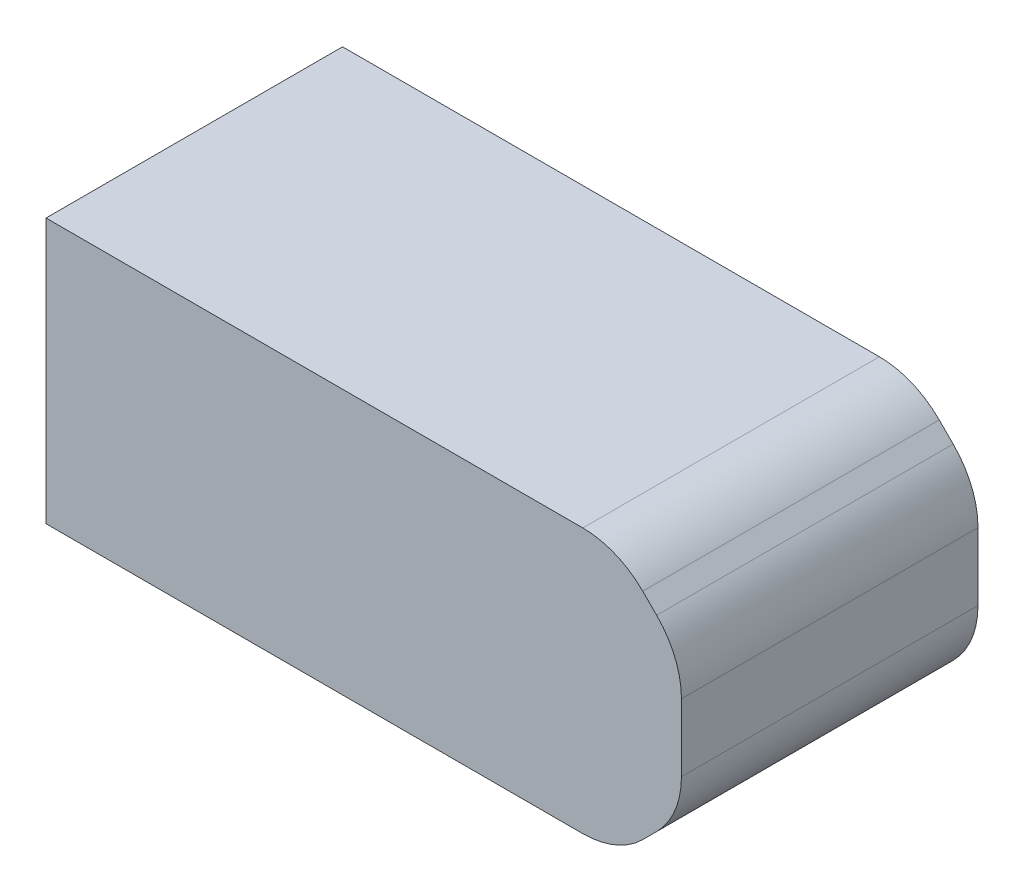
ISO-10303-21;
HEADER;
FILE_DESCRIPTION(('STEP AP214'),'2;1');
FILE_NAME('part.step','',(''),(''),'','','');
FILE_SCHEMA(('AUTOMOTIVE_DESIGN { 1 0 10303 214 1 1 1 1 }'));
ENDSEC;
DATA;
#1=APPLICATION_CONTEXT('core data for automotive mechanical design processes');
#2=APPLICATION_PROTOCOL_DEFINITION('international standard','automotive_design',2000,#1);
#3=PRODUCT_CONTEXT('',#1,'mechanical');
#4=PRODUCT('Part','Part','',(#3));
#5=PRODUCT_RELATED_PRODUCT_CATEGORY('part','',(#4));
#6=PRODUCT_DEFINITION_FORMATION('','',#4);
#7=PRODUCT_DEFINITION_CONTEXT('part definition',#1,'design');
#8=PRODUCT_DEFINITION('design','',#6,#7);
#9=PRODUCT_DEFINITION_SHAPE('','',#8);
#10=(LENGTH_UNIT() NAMED_UNIT(*) SI_UNIT(.MILLI.,.METRE.));
#11=(NAMED_UNIT(*) PLANE_ANGLE_UNIT() SI_UNIT($,.RADIAN.));
#12=(NAMED_UNIT(*) SI_UNIT($,.STERADIAN.) SOLID_ANGLE_UNIT());
#13=UNCERTAINTY_MEASURE_WITH_UNIT(LENGTH_MEASURE(1.E-05),#10,'distance_accuracy_value','');
#14=(GEOMETRIC_REPRESENTATION_CONTEXT(3) GLOBAL_UNCERTAINTY_ASSIGNED_CONTEXT((#13)) GLOBAL_UNIT_ASSIGNED_CONTEXT((#10,
#11,#12)) REPRESENTATION_CONTEXT('',''));
#15=CARTESIAN_POINT('',(0.,0.,0.));
#16=DIRECTION('',(0.,0.,1.));
#17=DIRECTION('',(1.,0.,0.));
#18=AXIS2_PLACEMENT_3D('',#15,#16,#17);
#19=CARTESIAN_POINT('',(30.,25.,-14.));
#20=DIRECTION('',(-1.,0.,0.));
#21=DIRECTION('',(0.,0.,1.));
#22=AXIS2_PLACEMENT_3D('',#19,#20,#21);
#23=PLANE('',#22);
#24=DIRECTION('',(0.,-1.,0.));
#25=VECTOR('',#24,1.);
#26=CARTESIAN_POINT('',(30.,25.,-14.));
#27=LINE('',#26,#25);
#28=CARTESIAN_POINT('',(30.,15.6862915010152,-14.));
#29=VERTEX_POINT('',#28);
#30=CARTESIAN_POINT('',(30.,9.31370849898477,-14.));
#31=VERTEX_POINT('',#30);
#32=EDGE_CURVE('E126',#29,#31,#27,.T.);
#33=ORIENTED_EDGE('',*,*,#32,.F.);
#34=DIRECTION('',(0.,0.,1.));
#35=VECTOR('',#34,1.);
#36=CARTESIAN_POINT('',(30.,15.6862915010152,14.));
#37=LINE('',#36,#35);
#38=CARTESIAN_POINT('',(30.,15.6862915010152,14.));
#39=VERTEX_POINT('',#38);
#40=EDGE_CURVE('E159',#29,#39,#37,.T.);
#41=ORIENTED_EDGE('',*,*,#40,.T.);
#42=DIRECTION('',(0.,-1.,0.));
#43=VECTOR('',#42,1.);
#44=CARTESIAN_POINT('',(30.,25.,14.));
#45=LINE('',#44,#43);
#46=CARTESIAN_POINT('',(30.,9.31370849898477,14.));
#47=VERTEX_POINT('',#46);
#48=EDGE_CURVE('E134',#39,#47,#45,.T.);
#49=ORIENTED_EDGE('',*,*,#48,.T.);
#50=DIRECTION('',(0.,0.,1.));
#51=VECTOR('',#50,1.);
#52=CARTESIAN_POINT('',(30.,9.31370849898477,-14.));
#53=LINE('',#52,#51);
#54=EDGE_CURVE('E156',#47,#31,#53,.F.);
#55=ORIENTED_EDGE('',*,*,#54,.T.);
#56=EDGE_LOOP('',(#33,#41,#49,#55));
#57=FACE_BOUND('',#56,.T.);
#58=ADVANCED_FACE('F35',(#57),#23,.F.);
#59=CARTESIAN_POINT('',(-30.,25.,-14.));
#60=DIRECTION('',(0.,0.,1.));
#61=DIRECTION('',(1.,0.,0.));
#62=AXIS2_PLACEMENT_3D('',#59,#60,#61);
#63=PLANE('',#62);
#64=DIRECTION('',(0.707106781186549,0.707106781186546,0.));
#65=VECTOR('',#64,1.);
#66=CARTESIAN_POINT('',(30.,6.00000000000001,-14.));
#67=LINE('',#66,#65);
#68=CARTESIAN_POINT('',(27.6568542494924,3.65685424949238,-14.));
#69=VERTEX_POINT('',#68);
#70=CARTESIAN_POINT('',(26.3431457505076,2.34314575050761,-14.));
#71=VERTEX_POINT('',#70);
#72=EDGE_CURVE('E149',#69,#71,#67,.F.);
#73=ORIENTED_EDGE('',*,*,#72,.T.);
#74=CARTESIAN_POINT('',(20.6862915010152,8.,-14.));
#75=DIRECTION('',(0.,0.,1.));
#76=DIRECTION('',(1.,0.,0.));
#77=AXIS2_PLACEMENT_3D('',#74,#75,#76);
#78=CIRCLE('',#77,8.);
#79=CARTESIAN_POINT('',(20.6862915010152,0.,-14.));
#80=VERTEX_POINT('',#79);
#81=EDGE_CURVE('E186',#71,#80,#78,.F.);
#82=ORIENTED_EDGE('',*,*,#81,.T.);
#83=DIRECTION('',(-1.,0.,0.));
#84=VECTOR('',#83,1.);
#85=CARTESIAN_POINT('',(-30.,0.,-14.));
#86=LINE('',#85,#84);
#87=CARTESIAN_POINT('',(-30.,0.,-14.));
#88=VERTEX_POINT('',#87);
#89=EDGE_CURVE('E123',#80,#88,#86,.T.);
#90=ORIENTED_EDGE('',*,*,#89,.T.);
#91=DIRECTION('',(0.,-1.,0.));
#92=VECTOR('',#91,1.);
#93=CARTESIAN_POINT('',(-30.,25.,-14.));
#94=LINE('',#93,#92);
#95=CARTESIAN_POINT('',(-30.,25.,-14.));
#96=VERTEX_POINT('',#95);
#97=EDGE_CURVE('E119',#96,#88,#94,.T.);
#98=ORIENTED_EDGE('',*,*,#97,.F.);
#99=DIRECTION('',(-1.,0.,0.));
#100=VECTOR('',#99,1.);
#101=CARTESIAN_POINT('',(-30.,25.,-14.));
#102=LINE('',#101,#100);
#103=CARTESIAN_POINT('',(20.6862915010152,25.,-14.));
#104=VERTEX_POINT('',#103);
#105=EDGE_CURVE('E109',#104,#96,#102,.T.);
#106=ORIENTED_EDGE('',*,*,#105,.F.);
#107=CARTESIAN_POINT('',(20.6862915010152,17.,-14.));
#108=DIRECTION('',(0.,0.,1.));
#109=DIRECTION('',(1.,0.,0.));
#110=AXIS2_PLACEMENT_3D('',#107,#108,#109);
#111=CIRCLE('',#110,8.);
#112=CARTESIAN_POINT('',(26.3431457505076,22.6568542494924,-14.));
#113=VERTEX_POINT('',#112);
#114=EDGE_CURVE('E50',#104,#113,#111,.F.);
#115=ORIENTED_EDGE('',*,*,#114,.T.);
#116=DIRECTION('',(0.707106781186546,-0.707106781186549,0.));
#117=VECTOR('',#116,1.);
#118=CARTESIAN_POINT('',(24.,25.,-14.));
#119=LINE('',#118,#117);
#120=CARTESIAN_POINT('',(27.6568542494924,21.3431457505076,-14.));
#121=VERTEX_POINT('',#120);
#122=EDGE_CURVE('E147',#113,#121,#119,.T.);
#123=ORIENTED_EDGE('',*,*,#122,.T.);
#124=CARTESIAN_POINT('',(22.,15.6862915010152,-14.));
#125=DIRECTION('',(0.,0.,1.));
#126=DIRECTION('',(1.,0.,0.));
#127=AXIS2_PLACEMENT_3D('',#124,#125,#126);
#128=CIRCLE('',#127,8.);
#129=EDGE_CURVE('E171',#121,#29,#128,.F.);
#130=ORIENTED_EDGE('',*,*,#129,.T.);
#131=ORIENTED_EDGE('',*,*,#32,.T.);
#132=CARTESIAN_POINT('',(22.,9.31370849898477,-14.));
#133=DIRECTION('',(0.,0.,1.));
#134=DIRECTION('',(1.,0.,0.));
#135=AXIS2_PLACEMENT_3D('',#132,#133,#134);
#136=CIRCLE('',#135,8.);
#137=EDGE_CURVE('E169',#31,#69,#136,.F.);
#138=ORIENTED_EDGE('',*,*,#137,.T.);
#139=EDGE_LOOP('',(#73,#82,#90,#98,#106,#115,#123,#130,#131,#138));
#140=FACE_BOUND('',#139,.T.);
#141=ADVANCED_FACE('F121',(#140),#63,.F.);
#142=CARTESIAN_POINT('',(-30.,25.,-14.));
#143=DIRECTION('',(1.,0.,0.));
#144=DIRECTION('',(0.,0.,-1.));
#145=AXIS2_PLACEMENT_3D('',#142,#143,#144);
#146=PLANE('',#145);
#147=DIRECTION('',(0.,0.,1.));
#148=VECTOR('',#147,1.);
#149=CARTESIAN_POINT('',(-30.,0.,-14.));
#150=LINE('',#149,#148);
#151=CARTESIAN_POINT('',(-30.,0.,14.));
#152=VERTEX_POINT('',#151);
#153=EDGE_CURVE('E138',#88,#152,#150,.T.);
#154=ORIENTED_EDGE('',*,*,#153,.T.);
#155=DIRECTION('',(0.,-1.,0.));
#156=VECTOR('',#155,1.);
#157=CARTESIAN_POINT('',(-30.,25.,14.));
#158=LINE('',#157,#156);
#159=CARTESIAN_POINT('',(-30.,25.,14.));
#160=VERTEX_POINT('',#159);
#161=EDGE_CURVE('E127',#160,#152,#158,.T.);
#162=ORIENTED_EDGE('',*,*,#161,.F.);
#163=DIRECTION('',(0.,0.,1.));
#164=VECTOR('',#163,1.);
#165=CARTESIAN_POINT('',(-30.,25.,-14.));
#166=LINE('',#165,#164);
#167=EDGE_CURVE('E114',#96,#160,#166,.T.);
#168=ORIENTED_EDGE('',*,*,#167,.F.);
#169=ORIENTED_EDGE('',*,*,#97,.T.);
#170=EDGE_LOOP('',(#154,#162,#168,#169));
#171=FACE_BOUND('',#170,.T.);
#172=ADVANCED_FACE('F129',(#171),#146,.F.);
#173=CARTESIAN_POINT('',(-30.,25.,14.));
#174=DIRECTION('',(0.,0.,-1.));
#175=DIRECTION('',(-1.,0.,0.));
#176=AXIS2_PLACEMENT_3D('',#173,#174,#175);
#177=PLANE('',#176);
#178=DIRECTION('',(1.,0.,0.));
#179=VECTOR('',#178,1.);
#180=CARTESIAN_POINT('',(-30.,0.,14.));
#181=LINE('',#180,#179);
#182=CARTESIAN_POINT('',(20.6862915010152,0.,14.));
#183=VERTEX_POINT('',#182);
#184=EDGE_CURVE('E116',#152,#183,#181,.T.);
#185=ORIENTED_EDGE('',*,*,#184,.T.);
#186=CARTESIAN_POINT('',(20.6862915010152,8.,14.));
#187=DIRECTION('',(0.,0.,-1.));
#188=DIRECTION('',(-1.,0.,0.));
#189=AXIS2_PLACEMENT_3D('',#186,#187,#188);
#190=CIRCLE('',#189,8.);
#191=CARTESIAN_POINT('',(26.3431457505076,2.34314575050761,14.));
#192=VERTEX_POINT('',#191);
#193=EDGE_CURVE('E181',#183,#192,#190,.F.);
#194=ORIENTED_EDGE('',*,*,#193,.T.);
#195=DIRECTION('',(-0.707106781186549,-0.707106781186546,0.));
#196=VECTOR('',#195,1.);
#197=CARTESIAN_POINT('',(30.,6.,14.));
#198=LINE('',#197,#196);
#199=CARTESIAN_POINT('',(27.6568542494924,3.65685424949238,14.));
#200=VERTEX_POINT('',#199);
#201=EDGE_CURVE('E154',#192,#200,#198,.F.);
#202=ORIENTED_EDGE('',*,*,#201,.T.);
#203=CARTESIAN_POINT('',(22.,9.31370849898477,14.));
#204=DIRECTION('',(0.,0.,-1.));
#205=DIRECTION('',(-1.,0.,0.));
#206=AXIS2_PLACEMENT_3D('',#203,#204,#205);
#207=CIRCLE('',#206,8.);
#208=EDGE_CURVE('E162',#200,#47,#207,.F.);
#209=ORIENTED_EDGE('',*,*,#208,.T.);
#210=ORIENTED_EDGE('',*,*,#48,.F.);
#211=CARTESIAN_POINT('',(22.,15.6862915010152,14.));
#212=DIRECTION('',(0.,0.,-1.));
#213=DIRECTION('',(-1.,0.,0.));
#214=AXIS2_PLACEMENT_3D('',#211,#212,#213);
#215=CIRCLE('',#214,8.);
#216=CARTESIAN_POINT('',(27.6568542494924,21.3431457505076,14.));
#217=VERTEX_POINT('',#216);
#218=EDGE_CURVE('E164',#39,#217,#215,.F.);
#219=ORIENTED_EDGE('',*,*,#218,.T.);
#220=DIRECTION('',(-0.707106781186546,0.707106781186549,0.));
#221=VECTOR('',#220,1.);
#222=CARTESIAN_POINT('',(24.,25.,14.));
#223=LINE('',#222,#221);
#224=CARTESIAN_POINT('',(26.3431457505076,22.6568542494924,14.));
#225=VERTEX_POINT('',#224);
#226=EDGE_CURVE('E151',#217,#225,#223,.T.);
#227=ORIENTED_EDGE('',*,*,#226,.T.);
#228=CARTESIAN_POINT('',(20.6862915010152,17.,14.));
#229=DIRECTION('',(0.,0.,-1.));
#230=DIRECTION('',(-1.,0.,0.));
#231=AXIS2_PLACEMENT_3D('',#228,#229,#230);
#232=CIRCLE('',#231,8.);
#233=CARTESIAN_POINT('',(20.6862915010152,25.,14.));
#234=VERTEX_POINT('',#233);
#235=EDGE_CURVE('E179',#225,#234,#232,.F.);
#236=ORIENTED_EDGE('',*,*,#235,.T.);
#237=DIRECTION('',(1.,0.,0.));
#238=VECTOR('',#237,1.);
#239=CARTESIAN_POINT('',(-30.,25.,14.));
#240=LINE('',#239,#238);
#241=EDGE_CURVE('E132',#160,#234,#240,.T.);
#242=ORIENTED_EDGE('',*,*,#241,.F.);
#243=ORIENTED_EDGE('',*,*,#161,.T.);
#244=EDGE_LOOP('',(#185,#194,#202,#209,#210,#219,#227,#236,#242,#243));
#245=FACE_BOUND('',#244,.T.);
#246=ADVANCED_FACE('F198',(#245),#177,.F.);
#247=CARTESIAN_POINT('',(0.,25.,0.));
#248=DIRECTION('',(0.,1.,0.));
#249=DIRECTION('',(0.,0.,1.));
#250=AXIS2_PLACEMENT_3D('',#247,#248,#249);
#251=PLANE('',#250);
#252=ORIENTED_EDGE('',*,*,#241,.T.);
#253=DIRECTION('',(0.,0.,-1.));
#254=VECTOR('',#253,1.);
#255=CARTESIAN_POINT('',(20.6862915010152,25.,0.));
#256=LINE('',#255,#254);
#257=EDGE_CURVE('E43',#234,#104,#256,.T.);
#258=ORIENTED_EDGE('',*,*,#257,.T.);
#259=ORIENTED_EDGE('',*,*,#105,.T.);
#260=ORIENTED_EDGE('',*,*,#167,.T.);
#261=EDGE_LOOP('',(#252,#258,#259,#260));
#262=FACE_BOUND('',#261,.T.);
#263=ADVANCED_FACE('F112',(#262),#251,.T.);
#264=CARTESIAN_POINT('',(0.,0.,0.));
#265=DIRECTION('',(0.,1.,0.));
#266=DIRECTION('',(0.,0.,1.));
#267=AXIS2_PLACEMENT_3D('',#264,#265,#266);
#268=PLANE('',#267);
#269=ORIENTED_EDGE('',*,*,#89,.F.);
#270=DIRECTION('',(0.,0.,-1.));
#271=VECTOR('',#270,1.);
#272=CARTESIAN_POINT('',(20.6862915010152,0.,14.));
#273=LINE('',#272,#271);
#274=EDGE_CURVE('E176',#80,#183,#273,.F.);
#275=ORIENTED_EDGE('',*,*,#274,.T.);
#276=ORIENTED_EDGE('',*,*,#184,.F.);
#277=ORIENTED_EDGE('',*,*,#153,.F.);
#278=EDGE_LOOP('',(#269,#275,#276,#277));
#279=FACE_BOUND('',#278,.T.);
#280=ADVANCED_FACE('F193',(#279),#268,.F.);
#281=CARTESIAN_POINT('',(30.,6.00000000000001,-14.));
#282=DIRECTION('',(-0.707106781186546,0.707106781186549,0.));
#283=DIRECTION('',(0.,0.,-1.));
#284=AXIS2_PLACEMENT_3D('',#281,#282,#283);
#285=PLANE('',#284);
#286=ORIENTED_EDGE('',*,*,#201,.F.);
#287=DIRECTION('',(0.,0.,1.));
#288=VECTOR('',#287,1.);
#289=CARTESIAN_POINT('',(26.3431457505076,2.34314575050761,-14.));
#290=LINE('',#289,#288);
#291=EDGE_CURVE('E183',#192,#71,#290,.F.);
#292=ORIENTED_EDGE('',*,*,#291,.T.);
#293=ORIENTED_EDGE('',*,*,#72,.F.);
#294=DIRECTION('',(0.,0.,-1.));
#295=VECTOR('',#294,1.);
#296=CARTESIAN_POINT('',(27.6568542494924,3.65685424949238,14.));
#297=LINE('',#296,#295);
#298=EDGE_CURVE('E173',#69,#200,#297,.F.);
#299=ORIENTED_EDGE('',*,*,#298,.T.);
#300=EDGE_LOOP('',(#286,#292,#293,#299));
#301=FACE_BOUND('',#300,.T.);
#302=ADVANCED_FACE('F200',(#301),#285,.F.);
#303=CARTESIAN_POINT('',(24.,25.,0.));
#304=DIRECTION('',(0.707106781186549,0.707106781186546,0.));
#305=DIRECTION('',(0.,0.,1.));
#306=AXIS2_PLACEMENT_3D('',#303,#304,#305);
#307=PLANE('',#306);
#308=ORIENTED_EDGE('',*,*,#122,.F.);
#309=DIRECTION('',(0.,0.,-1.));
#310=VECTOR('',#309,1.);
#311=CARTESIAN_POINT('',(26.3431457505076,22.6568542494924,0.));
#312=LINE('',#311,#310);
#313=EDGE_CURVE('E11',#113,#225,#312,.F.);
#314=ORIENTED_EDGE('',*,*,#313,.T.);
#315=ORIENTED_EDGE('',*,*,#226,.F.);
#316=DIRECTION('',(0.,0.,1.));
#317=VECTOR('',#316,1.);
#318=CARTESIAN_POINT('',(27.6568542494924,21.3431457505076,-14.));
#319=LINE('',#318,#317);
#320=EDGE_CURVE('E166',#217,#121,#319,.F.);
#321=ORIENTED_EDGE('',*,*,#320,.T.);
#322=EDGE_LOOP('',(#308,#314,#315,#321));
#323=FACE_BOUND('',#322,.T.);
#324=ADVANCED_FACE('F217',(#323),#307,.T.);
#325=CARTESIAN_POINT('',(22.,15.6862915010152,-14.));
#326=DIRECTION('',(0.,0.,-1.));
#327=DIRECTION('',(-1.,0.,0.));
#328=AXIS2_PLACEMENT_3D('',#325,#326,#327);
#329=CYLINDRICAL_SURFACE('',#328,8.);
#330=ORIENTED_EDGE('',*,*,#129,.F.);
#331=ORIENTED_EDGE('',*,*,#320,.F.);
#332=ORIENTED_EDGE('',*,*,#218,.F.);
#333=ORIENTED_EDGE('',*,*,#40,.F.);
#334=EDGE_LOOP('',(#330,#331,#332,#333));
#335=FACE_BOUND('',#334,.T.);
#336=ADVANCED_FACE('F212',(#335),#329,.T.);
#337=CARTESIAN_POINT('',(22.,9.31370849898477,-14.));
#338=DIRECTION('',(0.,0.,-1.));
#339=DIRECTION('',(-1.,0.,0.));
#340=AXIS2_PLACEMENT_3D('',#337,#338,#339);
#341=CYLINDRICAL_SURFACE('',#340,8.);
#342=ORIENTED_EDGE('',*,*,#208,.F.);
#343=ORIENTED_EDGE('',*,*,#298,.F.);
#344=ORIENTED_EDGE('',*,*,#137,.F.);
#345=ORIENTED_EDGE('',*,*,#54,.F.);
#346=EDGE_LOOP('',(#342,#343,#344,#345));
#347=FACE_BOUND('',#346,.T.);
#348=ADVANCED_FACE('F205',(#347),#341,.T.);
#349=CARTESIAN_POINT('',(20.6862915010152,8.,0.));
#350=DIRECTION('',(0.,0.,1.));
#351=DIRECTION('',(1.,0.,0.));
#352=AXIS2_PLACEMENT_3D('',#349,#350,#351);
#353=CYLINDRICAL_SURFACE('',#352,8.);
#354=ORIENTED_EDGE('',*,*,#81,.F.);
#355=ORIENTED_EDGE('',*,*,#291,.F.);
#356=ORIENTED_EDGE('',*,*,#193,.F.);
#357=ORIENTED_EDGE('',*,*,#274,.F.);
#358=EDGE_LOOP('',(#354,#355,#356,#357));
#359=FACE_BOUND('',#358,.T.);
#360=ADVANCED_FACE('F195',(#359),#353,.T.);
#361=CARTESIAN_POINT('',(20.6862915010152,17.,0.));
#362=DIRECTION('',(0.,0.,-1.));
#363=DIRECTION('',(-1.,0.,0.));
#364=AXIS2_PLACEMENT_3D('',#361,#362,#363);
#365=CYLINDRICAL_SURFACE('',#364,8.);
#366=ORIENTED_EDGE('',*,*,#235,.F.);
#367=ORIENTED_EDGE('',*,*,#313,.F.);
#368=ORIENTED_EDGE('',*,*,#114,.F.);
#369=ORIENTED_EDGE('',*,*,#257,.F.);
#370=EDGE_LOOP('',(#366,#367,#368,#369));
#371=FACE_BOUND('',#370,.T.);
#372=ADVANCED_FACE('F37',(#371),#365,.T.);
#373=CLOSED_SHELL('',(#58,#141,#172,#246,#263,#280,#302,#324,#336,#348,#360,#372));
#374=MANIFOLD_SOLID_BREP('B2',#373);
#375=ADVANCED_BREP_SHAPE_REPRESENTATION('',(#18,#374),#14);
#376=SHAPE_DEFINITION_REPRESENTATION(#9,#375);
ENDSEC;
END-ISO-10303-21;
